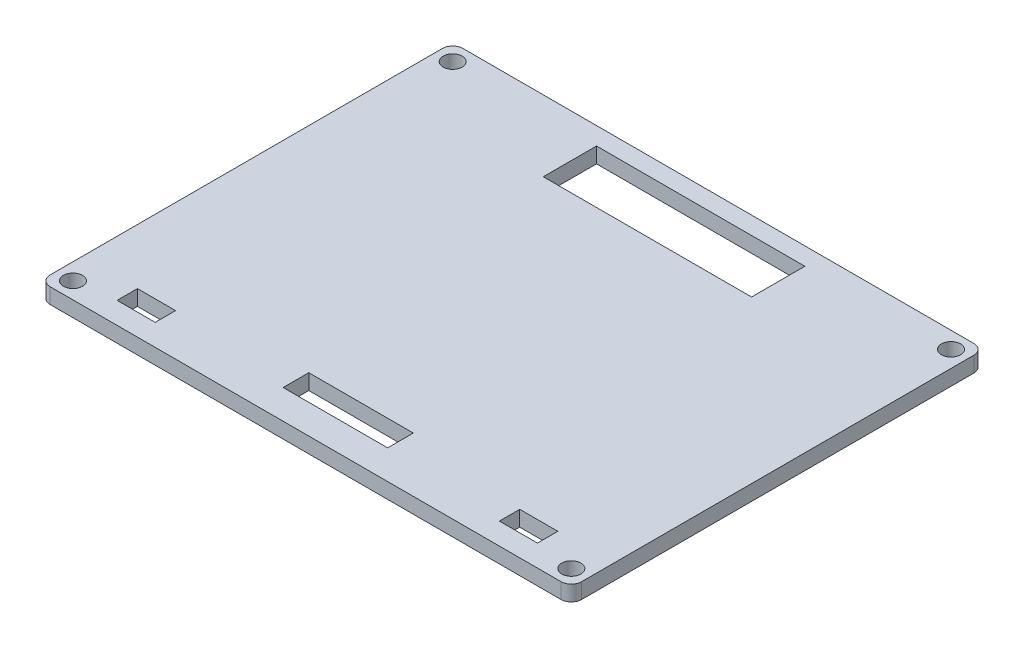
ISO-10303-21;
HEADER;
FILE_DESCRIPTION(('STEP AP214'),'2;1');
FILE_NAME('part.step','',(''),(''),'','','');
FILE_SCHEMA(('AUTOMOTIVE_DESIGN { 1 0 10303 214 1 1 1 1 }'));
ENDSEC;
DATA;
#1=APPLICATION_CONTEXT('core data for automotive mechanical design processes');
#2=APPLICATION_PROTOCOL_DEFINITION('international standard','automotive_design',2000,#1);
#3=PRODUCT_CONTEXT('',#1,'mechanical');
#4=PRODUCT('Part','Part','',(#3));
#5=PRODUCT_RELATED_PRODUCT_CATEGORY('part','',(#4));
#6=PRODUCT_DEFINITION_FORMATION('','',#4);
#7=PRODUCT_DEFINITION_CONTEXT('part definition',#1,'design');
#8=PRODUCT_DEFINITION('design','',#6,#7);
#9=PRODUCT_DEFINITION_SHAPE('','',#8);
#10=(LENGTH_UNIT() NAMED_UNIT(*) SI_UNIT(.MILLI.,.METRE.));
#11=(NAMED_UNIT(*) PLANE_ANGLE_UNIT() SI_UNIT($,.RADIAN.));
#12=(NAMED_UNIT(*) SI_UNIT($,.STERADIAN.) SOLID_ANGLE_UNIT());
#13=UNCERTAINTY_MEASURE_WITH_UNIT(LENGTH_MEASURE(1.E-05),#10,'distance_accuracy_value','');
#14=(GEOMETRIC_REPRESENTATION_CONTEXT(3) GLOBAL_UNCERTAINTY_ASSIGNED_CONTEXT((#13)) GLOBAL_UNIT_ASSIGNED_CONTEXT((#10,
#11,#12)) REPRESENTATION_CONTEXT('',''));
#15=CARTESIAN_POINT('',(0.,0.,0.));
#16=DIRECTION('',(0.,0.,1.));
#17=DIRECTION('',(1.,0.,0.));
#18=AXIS2_PLACEMENT_3D('',#15,#16,#17);
#19=CARTESIAN_POINT('',(33.3536078476636,3.,0.));
#20=DIRECTION('',(1.,0.,0.));
#21=DIRECTION('',(0.,0.,-1.));
#22=AXIS2_PLACEMENT_3D('',#19,#20,#21);
#23=PLANE('',#22);
#24=DIRECTION('',(0.,0.,1.));
#25=VECTOR('',#24,1.);
#26=CARTESIAN_POINT('',(33.3536078476636,0.,0.));
#27=LINE('',#26,#25);
#28=CARTESIAN_POINT('',(33.3536078476636,0.,31.8541583720559));
#29=VERTEX_POINT('',#28);
#30=CARTESIAN_POINT('',(33.3536078476636,0.,35.8039277224372));
#31=VERTEX_POINT('',#30);
#32=EDGE_CURVE('E356',#29,#31,#27,.T.);
#33=ORIENTED_EDGE('',*,*,#32,.F.);
#34=DIRECTION('',(0.,-1.,0.));
#35=VECTOR('',#34,1.);
#36=CARTESIAN_POINT('',(33.3536078476636,3.,31.8541583720559));
#37=LINE('',#36,#35);
#38=CARTESIAN_POINT('',(33.3536078476636,3.,31.8541583720559));
#39=VERTEX_POINT('',#38);
#40=EDGE_CURVE('E11',#39,#29,#37,.T.);
#41=ORIENTED_EDGE('',*,*,#40,.F.);
#42=DIRECTION('',(0.,0.,1.));
#43=VECTOR('',#42,1.);
#44=CARTESIAN_POINT('',(33.3536078476636,3.,0.));
#45=LINE('',#44,#43);
#46=CARTESIAN_POINT('',(33.3536078476636,3.,35.8039277224372));
#47=VERTEX_POINT('',#46);
#48=EDGE_CURVE('E223',#39,#47,#45,.T.);
#49=ORIENTED_EDGE('',*,*,#48,.T.);
#50=DIRECTION('',(0.,-1.,0.));
#51=VECTOR('',#50,1.);
#52=CARTESIAN_POINT('',(33.3536078476636,3.,35.8039277224372));
#53=LINE('',#52,#51);
#54=EDGE_CURVE('E60',#47,#31,#53,.T.);
#55=ORIENTED_EDGE('',*,*,#54,.T.);
#56=EDGE_LOOP('',(#33,#41,#49,#55));
#57=FACE_BOUND('',#56,.T.);
#58=ADVANCED_FACE('F41',(#57),#23,.T.);
#59=CARTESIAN_POINT('',(0.,3.,31.8541583720559));
#60=DIRECTION('',(0.,0.,-1.));
#61=DIRECTION('',(-1.,0.,0.));
#62=AXIS2_PLACEMENT_3D('',#59,#60,#61);
#63=PLANE('',#62);
#64=DIRECTION('',(1.,0.,0.));
#65=VECTOR('',#64,1.);
#66=CARTESIAN_POINT('',(0.,0.,31.8541583720559));
#67=LINE('',#66,#65);
#68=CARTESIAN_POINT('',(40.7411394104137,0.,31.8541583720559));
#69=VERTEX_POINT('',#68);
#70=EDGE_CURVE('E228',#29,#69,#67,.T.);
#71=ORIENTED_EDGE('',*,*,#70,.T.);
#72=DIRECTION('',(0.,-1.,0.));
#73=VECTOR('',#72,1.);
#74=CARTESIAN_POINT('',(40.7411394104137,3.,31.8541583720559));
#75=LINE('',#74,#73);
#76=CARTESIAN_POINT('',(40.7411394104137,3.,31.8541583720559));
#77=VERTEX_POINT('',#76);
#78=EDGE_CURVE('E51',#77,#69,#75,.T.);
#79=ORIENTED_EDGE('',*,*,#78,.F.);
#80=DIRECTION('',(1.,0.,0.));
#81=VECTOR('',#80,1.);
#82=CARTESIAN_POINT('',(0.,3.,31.8541583720559));
#83=LINE('',#82,#81);
#84=EDGE_CURVE('E218',#39,#77,#83,.T.);
#85=ORIENTED_EDGE('',*,*,#84,.F.);
#86=ORIENTED_EDGE('',*,*,#40,.T.);
#87=EDGE_LOOP('',(#71,#79,#85,#86));
#88=FACE_BOUND('',#87,.T.);
#89=ADVANCED_FACE('F226',(#88),#63,.F.);
#90=CARTESIAN_POINT('',(40.7411394104137,3.,0.));
#91=DIRECTION('',(1.,0.,0.));
#92=DIRECTION('',(0.,0.,-1.));
#93=AXIS2_PLACEMENT_3D('',#90,#91,#92);
#94=PLANE('',#93);
#95=DIRECTION('',(0.,0.,1.));
#96=VECTOR('',#95,1.);
#97=CARTESIAN_POINT('',(40.7411394104137,0.,0.));
#98=LINE('',#97,#96);
#99=CARTESIAN_POINT('',(40.7411394104137,0.,35.8039277224372));
#100=VERTEX_POINT('',#99);
#101=EDGE_CURVE('E359',#69,#100,#98,.T.);
#102=ORIENTED_EDGE('',*,*,#101,.T.);
#103=DIRECTION('',(0.,-1.,0.));
#104=VECTOR('',#103,1.);
#105=CARTESIAN_POINT('',(40.7411394104137,3.,35.8039277224372));
#106=LINE('',#105,#104);
#107=CARTESIAN_POINT('',(40.7411394104137,3.,35.8039277224372));
#108=VERTEX_POINT('',#107);
#109=EDGE_CURVE('E134',#108,#100,#106,.T.);
#110=ORIENTED_EDGE('',*,*,#109,.F.);
#111=DIRECTION('',(0.,0.,1.));
#112=VECTOR('',#111,1.);
#113=CARTESIAN_POINT('',(40.7411394104137,3.,0.));
#114=LINE('',#113,#112);
#115=EDGE_CURVE('E210',#77,#108,#114,.T.);
#116=ORIENTED_EDGE('',*,*,#115,.F.);
#117=ORIENTED_EDGE('',*,*,#78,.T.);
#118=EDGE_LOOP('',(#102,#110,#116,#117));
#119=FACE_BOUND('',#118,.T.);
#120=ADVANCED_FACE('F212',(#119),#94,.F.);
#121=CARTESIAN_POINT('',(-40.7411394104137,3.,0.));
#122=DIRECTION('',(1.,0.,0.));
#123=DIRECTION('',(0.,0.,-1.));
#124=AXIS2_PLACEMENT_3D('',#121,#122,#123);
#125=PLANE('',#124);
#126=DIRECTION('',(0.,0.,1.));
#127=VECTOR('',#126,1.);
#128=CARTESIAN_POINT('',(-40.7411394104137,0.,0.));
#129=LINE('',#128,#127);
#130=CARTESIAN_POINT('',(-40.7411394104137,0.,31.8541583720559));
#131=VERTEX_POINT('',#130);
#132=CARTESIAN_POINT('',(-40.7411394104137,0.,35.8039277224372));
#133=VERTEX_POINT('',#132);
#134=EDGE_CURVE('E344',#131,#133,#129,.T.);
#135=ORIENTED_EDGE('',*,*,#134,.F.);
#136=DIRECTION('',(0.,-1.,0.));
#137=VECTOR('',#136,1.);
#138=CARTESIAN_POINT('',(-40.7411394104137,3.,31.8541583720559));
#139=LINE('',#138,#137);
#140=CARTESIAN_POINT('',(-40.7411394104137,3.,31.8541583720559));
#141=VERTEX_POINT('',#140);
#142=EDGE_CURVE('E241',#141,#131,#139,.T.);
#143=ORIENTED_EDGE('',*,*,#142,.F.);
#144=DIRECTION('',(0.,0.,1.));
#145=VECTOR('',#144,1.);
#146=CARTESIAN_POINT('',(-40.7411394104137,3.,0.));
#147=LINE('',#146,#145);
#148=CARTESIAN_POINT('',(-40.7411394104137,3.,35.8039277224372));
#149=VERTEX_POINT('',#148);
#150=EDGE_CURVE('E418',#141,#149,#147,.T.);
#151=ORIENTED_EDGE('',*,*,#150,.T.);
#152=DIRECTION('',(0.,-1.,0.));
#153=VECTOR('',#152,1.);
#154=CARTESIAN_POINT('',(-40.7411394104137,3.,35.8039277224372));
#155=LINE('',#154,#153);
#156=EDGE_CURVE('E233',#149,#133,#155,.T.);
#157=ORIENTED_EDGE('',*,*,#156,.T.);
#158=EDGE_LOOP('',(#135,#143,#151,#157));
#159=FACE_BOUND('',#158,.T.);
#160=ADVANCED_FACE('F465',(#159),#125,.T.);
#161=CARTESIAN_POINT('',(0.,3.,31.8541583720559));
#162=DIRECTION('',(0.,0.,1.));
#163=DIRECTION('',(1.,0.,0.));
#164=AXIS2_PLACEMENT_3D('',#161,#162,#163);
#165=PLANE('',#164);
#166=DIRECTION('',(-1.,0.,0.));
#167=VECTOR('',#166,1.);
#168=CARTESIAN_POINT('',(0.,0.,31.8541583720559));
#169=LINE('',#168,#167);
#170=CARTESIAN_POINT('',(-33.3536078476636,0.,31.8541583720559));
#171=VERTEX_POINT('',#170);
#172=EDGE_CURVE('E347',#171,#131,#169,.T.);
#173=ORIENTED_EDGE('',*,*,#172,.F.);
#174=DIRECTION('',(0.,-1.,0.));
#175=VECTOR('',#174,1.);
#176=CARTESIAN_POINT('',(-33.3536078476636,3.,31.8541583720559));
#177=LINE('',#176,#175);
#178=CARTESIAN_POINT('',(-33.3536078476636,3.,31.8541583720559));
#179=VERTEX_POINT('',#178);
#180=EDGE_CURVE('E239',#179,#171,#177,.T.);
#181=ORIENTED_EDGE('',*,*,#180,.F.);
#182=DIRECTION('',(-1.,0.,0.));
#183=VECTOR('',#182,1.);
#184=CARTESIAN_POINT('',(0.,3.,31.8541583720559));
#185=LINE('',#184,#183);
#186=EDGE_CURVE('E421',#179,#141,#185,.T.);
#187=ORIENTED_EDGE('',*,*,#186,.T.);
#188=ORIENTED_EDGE('',*,*,#142,.T.);
#189=EDGE_LOOP('',(#173,#181,#187,#188));
#190=FACE_BOUND('',#189,.T.);
#191=ADVANCED_FACE('F461',(#190),#165,.T.);
#192=CARTESIAN_POINT('',(-33.3536078476636,3.,0.));
#193=DIRECTION('',(1.,0.,0.));
#194=DIRECTION('',(0.,0.,-1.));
#195=AXIS2_PLACEMENT_3D('',#192,#193,#194);
#196=PLANE('',#195);
#197=DIRECTION('',(0.,0.,1.));
#198=VECTOR('',#197,1.);
#199=CARTESIAN_POINT('',(-33.3536078476636,0.,0.));
#200=LINE('',#199,#198);
#201=CARTESIAN_POINT('',(-33.3536078476636,0.,35.8039277224372));
#202=VERTEX_POINT('',#201);
#203=EDGE_CURVE('E350',#171,#202,#200,.T.);
#204=ORIENTED_EDGE('',*,*,#203,.T.);
#205=DIRECTION('',(0.,-1.,0.));
#206=VECTOR('',#205,1.);
#207=CARTESIAN_POINT('',(-33.3536078476636,3.,35.8039277224372));
#208=LINE('',#207,#206);
#209=CARTESIAN_POINT('',(-33.3536078476636,3.,35.8039277224372));
#210=VERTEX_POINT('',#209);
#211=EDGE_CURVE('E235',#210,#202,#208,.T.);
#212=ORIENTED_EDGE('',*,*,#211,.F.);
#213=DIRECTION('',(0.,0.,1.));
#214=VECTOR('',#213,1.);
#215=CARTESIAN_POINT('',(-33.3536078476636,3.,0.));
#216=LINE('',#215,#214);
#217=EDGE_CURVE('E424',#179,#210,#216,.T.);
#218=ORIENTED_EDGE('',*,*,#217,.F.);
#219=ORIENTED_EDGE('',*,*,#180,.T.);
#220=EDGE_LOOP('',(#204,#212,#218,#219));
#221=FACE_BOUND('',#220,.T.);
#222=ADVANCED_FACE('F457',(#221),#196,.F.);
#223=CARTESIAN_POINT('',(0.,3.,29.3672665588529));
#224=DIRECTION('',(0.,0.,-1.));
#225=DIRECTION('',(-1.,0.,0.));
#226=AXIS2_PLACEMENT_3D('',#223,#224,#225);
#227=PLANE('',#226);
#228=DIRECTION('',(1.,0.,0.));
#229=VECTOR('',#228,1.);
#230=CARTESIAN_POINT('',(0.,0.,29.3672665588529));
#231=LINE('',#230,#229);
#232=CARTESIAN_POINT('',(-10.0207111296709,0.,29.3672665588529));
#233=VERTEX_POINT('',#232);
#234=CARTESIAN_POINT('',(10.2401427602476,0.,29.3672665588529));
#235=VERTEX_POINT('',#234);
#236=EDGE_CURVE('E332',#233,#235,#231,.T.);
#237=ORIENTED_EDGE('',*,*,#236,.T.);
#238=DIRECTION('',(0.,-1.,0.));
#239=VECTOR('',#238,1.);
#240=CARTESIAN_POINT('',(10.2401427602476,3.,29.3672665588529));
#241=LINE('',#240,#239);
#242=CARTESIAN_POINT('',(10.2401427602476,3.,29.3672665588529));
#243=VERTEX_POINT('',#242);
#244=EDGE_CURVE('E236',#243,#235,#241,.T.);
#245=ORIENTED_EDGE('',*,*,#244,.F.);
#246=DIRECTION('',(1.,0.,0.));
#247=VECTOR('',#246,1.);
#248=CARTESIAN_POINT('',(0.,3.,29.3672665588529));
#249=LINE('',#248,#247);
#250=CARTESIAN_POINT('',(-10.0207111296709,3.,29.3672665588529));
#251=VERTEX_POINT('',#250);
#252=EDGE_CURVE('E407',#251,#243,#249,.T.);
#253=ORIENTED_EDGE('',*,*,#252,.F.);
#254=DIRECTION('',(0.,-1.,0.));
#255=VECTOR('',#254,1.);
#256=CARTESIAN_POINT('',(-10.0207111296709,3.,29.3672665588529));
#257=LINE('',#256,#255);
#258=EDGE_CURVE('E243',#251,#233,#257,.T.);
#259=ORIENTED_EDGE('',*,*,#258,.T.);
#260=EDGE_LOOP('',(#237,#245,#253,#259));
#261=FACE_BOUND('',#260,.T.);
#262=ADVANCED_FACE('F460',(#261),#227,.F.);
#263=CARTESIAN_POINT('',(10.2401427602476,3.,0.));
#264=DIRECTION('',(1.,0.,0.));
#265=DIRECTION('',(0.,0.,-1.));
#266=AXIS2_PLACEMENT_3D('',#263,#264,#265);
#267=PLANE('',#266);
#268=DIRECTION('',(0.,0.,1.));
#269=VECTOR('',#268,1.);
#270=CARTESIAN_POINT('',(10.2401427602476,0.,0.));
#271=LINE('',#270,#269);
#272=CARTESIAN_POINT('',(10.2401427602476,0.,34.3410501852589));
#273=VERTEX_POINT('',#272);
#274=EDGE_CURVE('E335',#235,#273,#271,.T.);
#275=ORIENTED_EDGE('',*,*,#274,.T.);
#276=DIRECTION('',(0.,-1.,0.));
#277=VECTOR('',#276,1.);
#278=CARTESIAN_POINT('',(10.2401427602476,3.,34.3410501852589));
#279=LINE('',#278,#277);
#280=CARTESIAN_POINT('',(10.2401427602476,3.,34.3410501852589));
#281=VERTEX_POINT('',#280);
#282=EDGE_CURVE('E248',#281,#273,#279,.T.);
#283=ORIENTED_EDGE('',*,*,#282,.F.);
#284=DIRECTION('',(0.,0.,1.));
#285=VECTOR('',#284,1.);
#286=CARTESIAN_POINT('',(10.2401427602476,3.,0.));
#287=LINE('',#286,#285);
#288=EDGE_CURVE('E410',#243,#281,#287,.T.);
#289=ORIENTED_EDGE('',*,*,#288,.F.);
#290=ORIENTED_EDGE('',*,*,#244,.T.);
#291=EDGE_LOOP('',(#275,#283,#289,#290));
#292=FACE_BOUND('',#291,.T.);
#293=ADVANCED_FACE('F478',(#292),#267,.F.);
#294=CARTESIAN_POINT('',(0.,3.,34.3410501852589));
#295=DIRECTION('',(0.,0.,-1.));
#296=DIRECTION('',(-1.,0.,0.));
#297=AXIS2_PLACEMENT_3D('',#294,#295,#296);
#298=PLANE('',#297);
#299=DIRECTION('',(1.,0.,0.));
#300=VECTOR('',#299,1.);
#301=CARTESIAN_POINT('',(0.,0.,34.3410501852589));
#302=LINE('',#301,#300);
#303=CARTESIAN_POINT('',(-10.0207111296709,0.,34.3410501852589));
#304=VERTEX_POINT('',#303);
#305=EDGE_CURVE('E338',#304,#273,#302,.T.);
#306=ORIENTED_EDGE('',*,*,#305,.F.);
#307=DIRECTION('',(0.,-1.,0.));
#308=VECTOR('',#307,1.);
#309=CARTESIAN_POINT('',(-10.0207111296709,3.,34.3410501852589));
#310=LINE('',#309,#308);
#311=CARTESIAN_POINT('',(-10.0207111296709,3.,34.3410501852589));
#312=VERTEX_POINT('',#311);
#313=EDGE_CURVE('E245',#312,#304,#310,.T.);
#314=ORIENTED_EDGE('',*,*,#313,.F.);
#315=DIRECTION('',(1.,0.,0.));
#316=VECTOR('',#315,1.);
#317=CARTESIAN_POINT('',(0.,3.,34.3410501852589));
#318=LINE('',#317,#316);
#319=EDGE_CURVE('E412',#312,#281,#318,.T.);
#320=ORIENTED_EDGE('',*,*,#319,.T.);
#321=ORIENTED_EDGE('',*,*,#282,.T.);
#322=EDGE_LOOP('',(#306,#314,#320,#321));
#323=FACE_BOUND('',#322,.T.);
#324=ADVANCED_FACE('F474',(#323),#298,.T.);
#325=CARTESIAN_POINT('',(0.,3.,-40.));
#326=DIRECTION('',(0.,0.,1.));
#327=DIRECTION('',(1.,0.,0.));
#328=AXIS2_PLACEMENT_3D('',#325,#326,#327);
#329=PLANE('',#328);
#330=DIRECTION('',(-1.,0.,0.));
#331=VECTOR('',#330,1.);
#332=CARTESIAN_POINT('',(0.,0.,-40.));
#333=LINE('',#332,#331);
#334=CARTESIAN_POINT('',(49.5,0.,-40.));
#335=VERTEX_POINT('',#334);
#336=CARTESIAN_POINT('',(-49.5,0.,-40.));
#337=VERTEX_POINT('',#336);
#338=EDGE_CURVE('E305',#335,#337,#333,.T.);
#339=ORIENTED_EDGE('',*,*,#338,.T.);
#340=DIRECTION('',(0.,-1.,0.));
#341=VECTOR('',#340,1.);
#342=CARTESIAN_POINT('',(-49.5,3.,-40.));
#343=LINE('',#342,#341);
#344=CARTESIAN_POINT('',(-49.5,3.,-40.));
#345=VERTEX_POINT('',#344);
#346=EDGE_CURVE('E246',#345,#337,#343,.T.);
#347=ORIENTED_EDGE('',*,*,#346,.F.);
#348=DIRECTION('',(-1.,0.,0.));
#349=VECTOR('',#348,1.);
#350=CARTESIAN_POINT('',(0.,3.,-40.));
#351=LINE('',#350,#349);
#352=CARTESIAN_POINT('',(49.5,3.,-40.));
#353=VERTEX_POINT('',#352);
#354=EDGE_CURVE('E381',#353,#345,#351,.T.);
#355=ORIENTED_EDGE('',*,*,#354,.F.);
#356=DIRECTION('',(0.,-1.,0.));
#357=VECTOR('',#356,1.);
#358=CARTESIAN_POINT('',(49.5,3.,-40.));
#359=LINE('',#358,#357);
#360=EDGE_CURVE('E252',#353,#335,#359,.T.);
#361=ORIENTED_EDGE('',*,*,#360,.T.);
#362=EDGE_LOOP('',(#339,#347,#355,#361));
#363=FACE_BOUND('',#362,.T.);
#364=ADVANCED_FACE('F477',(#363),#329,.F.);
#365=CARTESIAN_POINT('',(-49.5,3.,-38.));
#366=DIRECTION('',(0.,-1.,0.));
#367=DIRECTION('',(0.,0.,-1.));
#368=AXIS2_PLACEMENT_3D('',#365,#366,#367);
#369=CYLINDRICAL_SURFACE('',#368,2.);
#370=CARTESIAN_POINT('',(-49.5,0.,-38.));
#371=DIRECTION('',(0.,1.,0.));
#372=DIRECTION('',(0.,0.,1.));
#373=AXIS2_PLACEMENT_3D('',#370,#371,#372);
#374=CIRCLE('',#373,2.);
#375=CARTESIAN_POINT('',(-51.5,0.,-38.));
#376=VERTEX_POINT('',#375);
#377=EDGE_CURVE('E308',#337,#376,#374,.T.);
#378=ORIENTED_EDGE('',*,*,#377,.T.);
#379=DIRECTION('',(0.,-1.,0.));
#380=VECTOR('',#379,1.);
#381=CARTESIAN_POINT('',(-51.5,3.,-38.));
#382=LINE('',#381,#380);
#383=CARTESIAN_POINT('',(-51.5,3.,-38.));
#384=VERTEX_POINT('',#383);
#385=EDGE_CURVE('E267',#384,#376,#382,.T.);
#386=ORIENTED_EDGE('',*,*,#385,.F.);
#387=CARTESIAN_POINT('',(-49.5,3.,-38.));
#388=DIRECTION('',(0.,1.,0.));
#389=DIRECTION('',(0.,0.,1.));
#390=AXIS2_PLACEMENT_3D('',#387,#388,#389);
#391=CIRCLE('',#390,2.);
#392=EDGE_CURVE('E384',#345,#384,#391,.T.);
#393=ORIENTED_EDGE('',*,*,#392,.F.);
#394=ORIENTED_EDGE('',*,*,#346,.T.);
#395=EDGE_LOOP('',(#378,#386,#393,#394));
#396=FACE_BOUND('',#395,.T.);
#397=ADVANCED_FACE('F517',(#396),#369,.T.);
#398=CARTESIAN_POINT('',(-51.5,3.,0.));
#399=DIRECTION('',(-1.,0.,0.));
#400=DIRECTION('',(0.,0.,1.));
#401=AXIS2_PLACEMENT_3D('',#398,#399,#400);
#402=PLANE('',#401);
#403=DIRECTION('',(0.,0.,-1.));
#404=VECTOR('',#403,1.);
#405=CARTESIAN_POINT('',(-51.5,0.,0.));
#406=LINE('',#405,#404);
#407=CARTESIAN_POINT('',(-51.5,0.,38.));
#408=VERTEX_POINT('',#407);
#409=EDGE_CURVE('E311',#408,#376,#406,.T.);
#410=ORIENTED_EDGE('',*,*,#409,.F.);
#411=DIRECTION('',(0.,-1.,0.));
#412=VECTOR('',#411,1.);
#413=CARTESIAN_POINT('',(-51.5,3.,38.));
#414=LINE('',#413,#412);
#415=CARTESIAN_POINT('',(-51.5,3.,38.));
#416=VERTEX_POINT('',#415);
#417=EDGE_CURVE('E265',#416,#408,#414,.T.);
#418=ORIENTED_EDGE('',*,*,#417,.F.);
#419=DIRECTION('',(0.,0.,-1.));
#420=VECTOR('',#419,1.);
#421=CARTESIAN_POINT('',(-51.5,3.,0.));
#422=LINE('',#421,#420);
#423=EDGE_CURVE('E386',#416,#384,#422,.T.);
#424=ORIENTED_EDGE('',*,*,#423,.T.);
#425=ORIENTED_EDGE('',*,*,#385,.T.);
#426=EDGE_LOOP('',(#410,#418,#424,#425));
#427=FACE_BOUND('',#426,.T.);
#428=ADVANCED_FACE('F513',(#427),#402,.T.);
#429=CARTESIAN_POINT('',(-49.5,3.,38.));
#430=DIRECTION('',(0.,-1.,0.));
#431=DIRECTION('',(0.,0.,-1.));
#432=AXIS2_PLACEMENT_3D('',#429,#430,#431);
#433=CYLINDRICAL_SURFACE('',#432,2.);
#434=CARTESIAN_POINT('',(-49.5,0.,38.));
#435=DIRECTION('',(0.,1.,0.));
#436=DIRECTION('',(0.,0.,1.));
#437=AXIS2_PLACEMENT_3D('',#434,#435,#436);
#438=CIRCLE('',#437,2.);
#439=CARTESIAN_POINT('',(-49.5,0.,40.));
#440=VERTEX_POINT('',#439);
#441=EDGE_CURVE('E314',#440,#408,#438,.F.);
#442=ORIENTED_EDGE('',*,*,#441,.F.);
#443=DIRECTION('',(0.,-1.,0.));
#444=VECTOR('',#443,1.);
#445=CARTESIAN_POINT('',(-49.5,3.,40.));
#446=LINE('',#445,#444);
#447=CARTESIAN_POINT('',(-49.5,3.,40.));
#448=VERTEX_POINT('',#447);
#449=EDGE_CURVE('E263',#448,#440,#446,.T.);
#450=ORIENTED_EDGE('',*,*,#449,.F.);
#451=CARTESIAN_POINT('',(-49.5,3.,38.));
#452=DIRECTION('',(0.,1.,0.));
#453=DIRECTION('',(0.,0.,1.));
#454=AXIS2_PLACEMENT_3D('',#451,#452,#453);
#455=CIRCLE('',#454,2.);
#456=EDGE_CURVE('E389',#448,#416,#455,.F.);
#457=ORIENTED_EDGE('',*,*,#456,.T.);
#458=ORIENTED_EDGE('',*,*,#417,.T.);
#459=EDGE_LOOP('',(#442,#450,#457,#458));
#460=FACE_BOUND('',#459,.T.);
#461=ADVANCED_FACE('F509',(#460),#433,.T.);
#462=CARTESIAN_POINT('',(0.,3.,40.));
#463=DIRECTION('',(0.,0.,1.));
#464=DIRECTION('',(1.,0.,0.));
#465=AXIS2_PLACEMENT_3D('',#462,#463,#464);
#466=PLANE('',#465);
#467=DIRECTION('',(-1.,0.,0.));
#468=VECTOR('',#467,1.);
#469=CARTESIAN_POINT('',(0.,0.,40.));
#470=LINE('',#469,#468);
#471=CARTESIAN_POINT('',(49.5,0.,40.));
#472=VERTEX_POINT('',#471);
#473=EDGE_CURVE('E317',#472,#440,#470,.T.);
#474=ORIENTED_EDGE('',*,*,#473,.F.);
#475=DIRECTION('',(0.,-1.,0.));
#476=VECTOR('',#475,1.);
#477=CARTESIAN_POINT('',(49.5,3.,40.));
#478=LINE('',#477,#476);
#479=CARTESIAN_POINT('',(49.5,3.,40.));
#480=VERTEX_POINT('',#479);
#481=EDGE_CURVE('E261',#480,#472,#478,.T.);
#482=ORIENTED_EDGE('',*,*,#481,.F.);
#483=DIRECTION('',(-1.,0.,0.));
#484=VECTOR('',#483,1.);
#485=CARTESIAN_POINT('',(0.,3.,40.));
#486=LINE('',#485,#484);
#487=EDGE_CURVE('E392',#480,#448,#486,.T.);
#488=ORIENTED_EDGE('',*,*,#487,.T.);
#489=ORIENTED_EDGE('',*,*,#449,.T.);
#490=EDGE_LOOP('',(#474,#482,#488,#489));
#491=FACE_BOUND('',#490,.T.);
#492=ADVANCED_FACE('F505',(#491),#466,.T.);
#493=CARTESIAN_POINT('',(49.5,3.,38.));
#494=DIRECTION('',(0.,-1.,0.));
#495=DIRECTION('',(0.,0.,-1.));
#496=AXIS2_PLACEMENT_3D('',#493,#494,#495);
#497=CYLINDRICAL_SURFACE('',#496,2.);
#498=CARTESIAN_POINT('',(49.5,0.,38.));
#499=DIRECTION('',(0.,1.,0.));
#500=DIRECTION('',(0.,0.,1.));
#501=AXIS2_PLACEMENT_3D('',#498,#499,#500);
#502=CIRCLE('',#501,2.);
#503=CARTESIAN_POINT('',(51.5,0.,38.));
#504=VERTEX_POINT('',#503);
#505=EDGE_CURVE('E320',#472,#504,#502,.T.);
#506=ORIENTED_EDGE('',*,*,#505,.T.);
#507=DIRECTION('',(0.,-1.,0.));
#508=VECTOR('',#507,1.);
#509=CARTESIAN_POINT('',(51.5,3.,38.));
#510=LINE('',#509,#508);
#511=CARTESIAN_POINT('',(51.5,3.,38.));
#512=VERTEX_POINT('',#511);
#513=EDGE_CURVE('E258',#512,#504,#510,.T.);
#514=ORIENTED_EDGE('',*,*,#513,.F.);
#515=CARTESIAN_POINT('',(49.5,3.,38.));
#516=DIRECTION('',(0.,1.,0.));
#517=DIRECTION('',(0.,0.,1.));
#518=AXIS2_PLACEMENT_3D('',#515,#516,#517);
#519=CIRCLE('',#518,2.);
#520=EDGE_CURVE('E395',#480,#512,#519,.T.);
#521=ORIENTED_EDGE('',*,*,#520,.F.);
#522=ORIENTED_EDGE('',*,*,#481,.T.);
#523=EDGE_LOOP('',(#506,#514,#521,#522));
#524=FACE_BOUND('',#523,.T.);
#525=ADVANCED_FACE('F501',(#524),#497,.T.);
#526=CARTESIAN_POINT('',(51.5,3.,0.));
#527=DIRECTION('',(-1.,0.,0.));
#528=DIRECTION('',(0.,0.,1.));
#529=AXIS2_PLACEMENT_3D('',#526,#527,#528);
#530=PLANE('',#529);
#531=DIRECTION('',(0.,0.,-1.));
#532=VECTOR('',#531,1.);
#533=CARTESIAN_POINT('',(51.5,0.,0.));
#534=LINE('',#533,#532);
#535=CARTESIAN_POINT('',(51.5,0.,-38.));
#536=VERTEX_POINT('',#535);
#537=EDGE_CURVE('E322',#504,#536,#534,.T.);
#538=ORIENTED_EDGE('',*,*,#537,.T.);
#539=DIRECTION('',(0.,-1.,0.));
#540=VECTOR('',#539,1.);
#541=CARTESIAN_POINT('',(51.5,3.,-38.));
#542=LINE('',#541,#540);
#543=CARTESIAN_POINT('',(51.5,3.,-38.));
#544=VERTEX_POINT('',#543);
#545=EDGE_CURVE('E255',#544,#536,#542,.T.);
#546=ORIENTED_EDGE('',*,*,#545,.F.);
#547=DIRECTION('',(0.,0.,-1.));
#548=VECTOR('',#547,1.);
#549=CARTESIAN_POINT('',(51.5,3.,0.));
#550=LINE('',#549,#548);
#551=EDGE_CURVE('E397',#512,#544,#550,.T.);
#552=ORIENTED_EDGE('',*,*,#551,.F.);
#553=ORIENTED_EDGE('',*,*,#513,.T.);
#554=EDGE_LOOP('',(#538,#546,#552,#553));
#555=FACE_BOUND('',#554,.T.);
#556=ADVANCED_FACE('F498',(#555),#530,.F.);
#557=CARTESIAN_POINT('',(0.,3.,-26.2491408524346));
#558=DIRECTION('',(0.,0.,1.));
#559=DIRECTION('',(1.,0.,0.));
#560=AXIS2_PLACEMENT_3D('',#557,#558,#559);
#561=PLANE('',#560);
#562=DIRECTION('',(-1.,0.,0.));
#563=VECTOR('',#562,1.);
#564=CARTESIAN_POINT('',(0.,0.,-26.2491408524346));
#565=LINE('',#564,#563);
#566=CARTESIAN_POINT('',(20.1874301732059,0.,-26.2491408524346));
#567=VERTEX_POINT('',#566);
#568=CARTESIAN_POINT('',(-20.1874301732059,0.,-26.2491408524346));
#569=VERTEX_POINT('',#568);
#570=EDGE_CURVE('E287',#567,#569,#565,.T.);
#571=ORIENTED_EDGE('',*,*,#570,.T.);
#572=DIRECTION('',(0.,-1.,0.));
#573=VECTOR('',#572,1.);
#574=CARTESIAN_POINT('',(-20.1874301732059,3.,-26.2491408524346));
#575=LINE('',#574,#573);
#576=CARTESIAN_POINT('',(-20.1874301732059,3.,-26.2491408524346));
#577=VERTEX_POINT('',#576);
#578=EDGE_CURVE('E45',#577,#569,#575,.T.);
#579=ORIENTED_EDGE('',*,*,#578,.F.);
#580=DIRECTION('',(-1.,0.,0.));
#581=VECTOR('',#580,1.);
#582=CARTESIAN_POINT('',(0.,3.,-26.2491408524346));
#583=LINE('',#582,#581);
#584=CARTESIAN_POINT('',(20.1874301732059,3.,-26.2491408524346));
#585=VERTEX_POINT('',#584);
#586=EDGE_CURVE('E363',#585,#577,#583,.T.);
#587=ORIENTED_EDGE('',*,*,#586,.F.);
#588=DIRECTION('',(0.,-1.,0.));
#589=VECTOR('',#588,1.);
#590=CARTESIAN_POINT('',(20.1874301732059,3.,-26.2491408524346));
#591=LINE('',#590,#589);
#592=EDGE_CURVE('E271',#585,#567,#591,.T.);
#593=ORIENTED_EDGE('',*,*,#592,.T.);
#594=EDGE_LOOP('',(#571,#579,#587,#593));
#595=FACE_BOUND('',#594,.T.);
#596=ADVANCED_FACE('F43',(#595),#561,.F.);
#597=CARTESIAN_POINT('',(-20.1874301732059,3.,0.));
#598=DIRECTION('',(-1.,0.,0.));
#599=DIRECTION('',(0.,0.,1.));
#600=AXIS2_PLACEMENT_3D('',#597,#598,#599);
#601=PLANE('',#600);
#602=DIRECTION('',(0.,0.,-1.));
#603=VECTOR('',#602,1.);
#604=CARTESIAN_POINT('',(-20.1874301732059,0.,0.));
#605=LINE('',#604,#603);
#606=CARTESIAN_POINT('',(-20.1874301732059,0.,-36.5704318741446));
#607=VERTEX_POINT('',#606);
#608=EDGE_CURVE('E282',#569,#607,#605,.T.);
#609=ORIENTED_EDGE('',*,*,#608,.T.);
#610=DIRECTION('',(0.,-1.,0.));
#611=VECTOR('',#610,1.);
#612=CARTESIAN_POINT('',(-20.1874301732059,3.,-36.5704318741446));
#613=LINE('',#612,#611);
#614=CARTESIAN_POINT('',(-20.1874301732059,3.,-36.5704318741446));
#615=VERTEX_POINT('',#614);
#616=EDGE_CURVE('E274',#615,#607,#613,.T.);
#617=ORIENTED_EDGE('',*,*,#616,.F.);
#618=DIRECTION('',(0.,0.,-1.));
#619=VECTOR('',#618,1.);
#620=CARTESIAN_POINT('',(-20.1874301732059,3.,0.));
#621=LINE('',#620,#619);
#622=EDGE_CURVE('E147',#577,#615,#621,.T.);
#623=ORIENTED_EDGE('',*,*,#622,.F.);
#624=ORIENTED_EDGE('',*,*,#578,.T.);
#625=EDGE_LOOP('',(#609,#617,#623,#624));
#626=FACE_BOUND('',#625,.T.);
#627=ADVANCED_FACE('F281',(#626),#601,.F.);
#628=CARTESIAN_POINT('',(0.,3.,-36.5704318741446));
#629=DIRECTION('',(0.,0.,1.));
#630=DIRECTION('',(1.,0.,0.));
#631=AXIS2_PLACEMENT_3D('',#628,#629,#630);
#632=PLANE('',#631);
#633=DIRECTION('',(-1.,0.,0.));
#634=VECTOR('',#633,1.);
#635=CARTESIAN_POINT('',(0.,0.,-36.5704318741446));
#636=LINE('',#635,#634);
#637=CARTESIAN_POINT('',(20.1874301732059,0.,-36.5704318741446));
#638=VERTEX_POINT('',#637);
#639=EDGE_CURVE('E292',#638,#607,#636,.T.);
#640=ORIENTED_EDGE('',*,*,#639,.F.);
#641=DIRECTION('',(0.,-1.,0.));
#642=VECTOR('',#641,1.);
#643=CARTESIAN_POINT('',(20.1874301732059,3.,-36.5704318741446));
#644=LINE('',#643,#642);
#645=CARTESIAN_POINT('',(20.1874301732059,3.,-36.5704318741446));
#646=VERTEX_POINT('',#645);
#647=EDGE_CURVE('E273',#646,#638,#644,.T.);
#648=ORIENTED_EDGE('',*,*,#647,.F.);
#649=DIRECTION('',(-1.,0.,0.));
#650=VECTOR('',#649,1.);
#651=CARTESIAN_POINT('',(0.,3.,-36.5704318741446));
#652=LINE('',#651,#650);
#653=EDGE_CURVE('E368',#646,#615,#652,.T.);
#654=ORIENTED_EDGE('',*,*,#653,.T.);
#655=ORIENTED_EDGE('',*,*,#616,.T.);
#656=EDGE_LOOP('',(#640,#648,#654,#655));
#657=FACE_BOUND('',#656,.T.);
#658=ADVANCED_FACE('F455',(#657),#632,.T.);
#659=CARTESIAN_POINT('',(0.,3.,35.8039277224372));
#660=DIRECTION('',(0.,0.,1.));
#661=DIRECTION('',(1.,0.,0.));
#662=AXIS2_PLACEMENT_3D('',#659,#660,#661);
#663=PLANE('',#662);
#664=DIRECTION('',(-1.,0.,0.));
#665=VECTOR('',#664,1.);
#666=CARTESIAN_POINT('',(0.,0.,35.8039277224372));
#667=LINE('',#666,#665);
#668=EDGE_CURVE('E353',#202,#133,#667,.T.);
#669=ORIENTED_EDGE('',*,*,#668,.T.);
#670=ORIENTED_EDGE('',*,*,#156,.F.);
#671=DIRECTION('',(-1.,0.,0.));
#672=VECTOR('',#671,1.);
#673=CARTESIAN_POINT('',(0.,3.,35.8039277224372));
#674=LINE('',#673,#672);
#675=EDGE_CURVE('E427',#210,#149,#674,.T.);
#676=ORIENTED_EDGE('',*,*,#675,.F.);
#677=ORIENTED_EDGE('',*,*,#211,.T.);
#678=EDGE_LOOP('',(#669,#670,#676,#677));
#679=FACE_BOUND('',#678,.T.);
#680=ADVANCED_FACE('F451',(#679),#663,.F.);
#681=CARTESIAN_POINT('',(-10.0207111296709,3.,0.));
#682=DIRECTION('',(1.,0.,0.));
#683=DIRECTION('',(0.,0.,-1.));
#684=AXIS2_PLACEMENT_3D('',#681,#682,#683);
#685=PLANE('',#684);
#686=DIRECTION('',(0.,0.,1.));
#687=VECTOR('',#686,1.);
#688=CARTESIAN_POINT('',(-10.0207111296709,0.,0.));
#689=LINE('',#688,#687);
#690=EDGE_CURVE('E341',#233,#304,#689,.T.);
#691=ORIENTED_EDGE('',*,*,#690,.F.);
#692=ORIENTED_EDGE('',*,*,#258,.F.);
#693=DIRECTION('',(0.,0.,1.));
#694=VECTOR('',#693,1.);
#695=CARTESIAN_POINT('',(-10.0207111296709,3.,0.));
#696=LINE('',#695,#694);
#697=EDGE_CURVE('E415',#251,#312,#696,.T.);
#698=ORIENTED_EDGE('',*,*,#697,.T.);
#699=ORIENTED_EDGE('',*,*,#313,.T.);
#700=EDGE_LOOP('',(#691,#692,#698,#699));
#701=FACE_BOUND('',#700,.T.);
#702=ADVANCED_FACE('F454',(#701),#685,.T.);
#703=CARTESIAN_POINT('',(48.296806281225,3.,36.7968062812248));
#704=DIRECTION('',(0.,-1.,0.));
#705=DIRECTION('',(0.,0.,-1.));
#706=AXIS2_PLACEMENT_3D('',#703,#704,#705);
#707=CYLINDRICAL_SURFACE('',#706,1.84999999999998);
#708=CARTESIAN_POINT('',(48.296806281225,3.,36.7968062812248));
#709=DIRECTION('',(0.,1.,0.));
#710=DIRECTION('',(0.,0.,1.));
#711=AXIS2_PLACEMENT_3D('',#708,#709,#710);
#712=CIRCLE('',#711,1.84999999999998);
#713=CARTESIAN_POINT('',(48.296806281225,3.,38.6468062812248));
#714=VERTEX_POINT('',#713);
#715=EDGE_CURVE('E404',#714,#714,#712,.T.);
#716=ORIENTED_EDGE('',*,*,#715,.T.);
#717=EDGE_LOOP('',(#716));
#718=FACE_BOUND('',#717,.T.);
#719=CARTESIAN_POINT('',(48.296806281225,0.,36.7968062812248));
#720=DIRECTION('',(0.,1.,0.));
#721=DIRECTION('',(0.,0.,1.));
#722=AXIS2_PLACEMENT_3D('',#719,#720,#721);
#723=CIRCLE('',#722,1.84999999999998);
#724=CARTESIAN_POINT('',(48.296806281225,0.,38.6468062812248));
#725=VERTEX_POINT('',#724);
#726=EDGE_CURVE('E329',#725,#725,#723,.T.);
#727=ORIENTED_EDGE('',*,*,#726,.F.);
#728=EDGE_LOOP('',(#727));
#729=FACE_BOUND('',#728,.T.);
#730=ADVANCED_FACE('F472',(#718,#729),#707,.F.);
#731=CARTESIAN_POINT('',(-48.2968062812249,3.,36.796806281225));
#732=DIRECTION('',(0.,-1.,0.));
#733=DIRECTION('',(0.,0.,-1.));
#734=AXIS2_PLACEMENT_3D('',#731,#732,#733);
#735=CYLINDRICAL_SURFACE('',#734,1.85);
#736=CARTESIAN_POINT('',(-48.2968062812249,3.,36.796806281225));
#737=DIRECTION('',(0.,1.,0.));
#738=DIRECTION('',(0.,0.,1.));
#739=AXIS2_PLACEMENT_3D('',#736,#737,#738);
#740=CIRCLE('',#739,1.85);
#741=CARTESIAN_POINT('',(-48.2968062812249,3.,38.646806281225));
#742=VERTEX_POINT('',#741);
#743=EDGE_CURVE('E401',#742,#742,#740,.F.);
#744=ORIENTED_EDGE('',*,*,#743,.F.);
#745=EDGE_LOOP('',(#744));
#746=FACE_BOUND('',#745,.T.);
#747=CARTESIAN_POINT('',(-48.2968062812249,0.,36.796806281225));
#748=DIRECTION('',(0.,1.,0.));
#749=DIRECTION('',(0.,0.,1.));
#750=AXIS2_PLACEMENT_3D('',#747,#748,#749);
#751=CIRCLE('',#750,1.85);
#752=CARTESIAN_POINT('',(-48.2968062812249,0.,38.646806281225));
#753=VERTEX_POINT('',#752);
#754=EDGE_CURVE('E326',#753,#753,#751,.F.);
#755=ORIENTED_EDGE('',*,*,#754,.T.);
#756=EDGE_LOOP('',(#755));
#757=FACE_BOUND('',#756,.T.);
#758=ADVANCED_FACE('F488',(#746,#757),#735,.F.);
#759=CARTESIAN_POINT('',(49.5,3.,-38.));
#760=DIRECTION('',(0.,-1.,0.));
#761=DIRECTION('',(0.,0.,-1.));
#762=AXIS2_PLACEMENT_3D('',#759,#760,#761);
#763=CYLINDRICAL_SURFACE('',#762,2.);
#764=CARTESIAN_POINT('',(49.5,0.,-38.));
#765=DIRECTION('',(0.,1.,0.));
#766=DIRECTION('',(0.,0.,1.));
#767=AXIS2_PLACEMENT_3D('',#764,#765,#766);
#768=CIRCLE('',#767,2.);
#769=EDGE_CURVE('E324',#536,#335,#768,.T.);
#770=ORIENTED_EDGE('',*,*,#769,.T.);
#771=ORIENTED_EDGE('',*,*,#360,.F.);
#772=CARTESIAN_POINT('',(49.5,3.,-38.));
#773=DIRECTION('',(0.,1.,0.));
#774=DIRECTION('',(0.,0.,1.));
#775=AXIS2_PLACEMENT_3D('',#772,#773,#774);
#776=CIRCLE('',#775,2.);
#777=EDGE_CURVE('E399',#544,#353,#776,.T.);
#778=ORIENTED_EDGE('',*,*,#777,.F.);
#779=ORIENTED_EDGE('',*,*,#545,.T.);
#780=EDGE_LOOP('',(#770,#771,#778,#779));
#781=FACE_BOUND('',#780,.T.);
#782=ADVANCED_FACE('F492',(#781),#763,.T.);
#783=CARTESIAN_POINT('',(48.2968062812249,3.,-36.7968062812249));
#784=DIRECTION('',(0.,-1.,0.));
#785=DIRECTION('',(0.,0.,-1.));
#786=AXIS2_PLACEMENT_3D('',#783,#784,#785);
#787=CYLINDRICAL_SURFACE('',#786,1.84999999999998);
#788=CARTESIAN_POINT('',(48.2968062812249,3.,-36.7968062812249));
#789=DIRECTION('',(0.,1.,0.));
#790=DIRECTION('',(0.,0.,1.));
#791=AXIS2_PLACEMENT_3D('',#788,#789,#790);
#792=CIRCLE('',#791,1.84999999999998);
#793=CARTESIAN_POINT('',(48.2968062812249,3.,-34.9468062812249));
#794=VERTEX_POINT('',#793);
#795=EDGE_CURVE('E378',#794,#794,#792,.F.);
#796=ORIENTED_EDGE('',*,*,#795,.F.);
#797=EDGE_LOOP('',(#796));
#798=FACE_BOUND('',#797,.T.);
#799=CARTESIAN_POINT('',(48.2968062812249,0.,-36.7968062812249));
#800=DIRECTION('',(0.,1.,0.));
#801=DIRECTION('',(0.,0.,1.));
#802=AXIS2_PLACEMENT_3D('',#799,#800,#801);
#803=CIRCLE('',#802,1.84999999999998);
#804=CARTESIAN_POINT('',(48.2968062812249,0.,-34.9468062812249));
#805=VERTEX_POINT('',#804);
#806=EDGE_CURVE('E302',#805,#805,#803,.F.);
#807=ORIENTED_EDGE('',*,*,#806,.T.);
#808=EDGE_LOOP('',(#807));
#809=FACE_BOUND('',#808,.T.);
#810=ADVANCED_FACE('F496',(#798,#809),#787,.F.);
#811=CARTESIAN_POINT('',(-48.2968062812249,3.,-36.796806281225));
#812=DIRECTION('',(0.,-1.,0.));
#813=DIRECTION('',(0.,0.,-1.));
#814=AXIS2_PLACEMENT_3D('',#811,#812,#813);
#815=CYLINDRICAL_SURFACE('',#814,1.84999999999996);
#816=CARTESIAN_POINT('',(-48.2968062812249,3.,-36.796806281225));
#817=DIRECTION('',(0.,1.,0.));
#818=DIRECTION('',(0.,0.,1.));
#819=AXIS2_PLACEMENT_3D('',#816,#817,#818);
#820=CIRCLE('',#819,1.84999999999996);
#821=CARTESIAN_POINT('',(-48.2968062812249,3.,-34.946806281225));
#822=VERTEX_POINT('',#821);
#823=EDGE_CURVE('E375',#822,#822,#820,.T.);
#824=ORIENTED_EDGE('',*,*,#823,.T.);
#825=EDGE_LOOP('',(#824));
#826=FACE_BOUND('',#825,.T.);
#827=CARTESIAN_POINT('',(-48.2968062812249,0.,-36.796806281225));
#828=DIRECTION('',(0.,1.,0.));
#829=DIRECTION('',(0.,0.,1.));
#830=AXIS2_PLACEMENT_3D('',#827,#828,#829);
#831=CIRCLE('',#830,1.84999999999996);
#832=CARTESIAN_POINT('',(-48.2968062812249,0.,-34.946806281225));
#833=VERTEX_POINT('',#832);
#834=EDGE_CURVE('E299',#833,#833,#831,.T.);
#835=ORIENTED_EDGE('',*,*,#834,.F.);
#836=EDGE_LOOP('',(#835));
#837=FACE_BOUND('',#836,.T.);
#838=ADVANCED_FACE('F439',(#826,#837),#815,.F.);
#839=CARTESIAN_POINT('',(20.1874301732059,3.,0.));
#840=DIRECTION('',(-1.,0.,0.));
#841=DIRECTION('',(0.,0.,1.));
#842=AXIS2_PLACEMENT_3D('',#839,#840,#841);
#843=PLANE('',#842);
#844=DIRECTION('',(0.,0.,-1.));
#845=VECTOR('',#844,1.);
#846=CARTESIAN_POINT('',(20.1874301732059,0.,0.));
#847=LINE('',#846,#845);
#848=EDGE_CURVE('E297',#567,#638,#847,.T.);
#849=ORIENTED_EDGE('',*,*,#848,.F.);
#850=ORIENTED_EDGE('',*,*,#592,.F.);
#851=DIRECTION('',(0.,0.,-1.));
#852=VECTOR('',#851,1.);
#853=CARTESIAN_POINT('',(20.1874301732059,3.,0.));
#854=LINE('',#853,#852);
#855=EDGE_CURVE('E372',#585,#646,#854,.T.);
#856=ORIENTED_EDGE('',*,*,#855,.T.);
#857=ORIENTED_EDGE('',*,*,#647,.T.);
#858=EDGE_LOOP('',(#849,#850,#856,#857));
#859=FACE_BOUND('',#858,.T.);
#860=ADVANCED_FACE('F431',(#859),#843,.T.);
#861=CARTESIAN_POINT('',(0.,3.,35.8039277224372));
#862=DIRECTION('',(0.,0.,-1.));
#863=DIRECTION('',(-1.,0.,0.));
#864=AXIS2_PLACEMENT_3D('',#861,#862,#863);
#865=PLANE('',#864);
#866=DIRECTION('',(1.,0.,0.));
#867=VECTOR('',#866,1.);
#868=CARTESIAN_POINT('',(0.,0.,35.8039277224372));
#869=LINE('',#868,#867);
#870=EDGE_CURVE('E361',#31,#100,#869,.T.);
#871=ORIENTED_EDGE('',*,*,#870,.F.);
#872=ORIENTED_EDGE('',*,*,#54,.F.);
#873=DIRECTION('',(1.,0.,0.));
#874=VECTOR('',#873,1.);
#875=CARTESIAN_POINT('',(0.,3.,35.8039277224372));
#876=LINE('',#875,#874);
#877=EDGE_CURVE('E217',#47,#108,#876,.T.);
#878=ORIENTED_EDGE('',*,*,#877,.T.);
#879=ORIENTED_EDGE('',*,*,#109,.T.);
#880=EDGE_LOOP('',(#871,#872,#878,#879));
#881=FACE_BOUND('',#880,.T.);
#882=ADVANCED_FACE('F429',(#881),#865,.T.);
#883=CARTESIAN_POINT('',(0.,3.,0.));
#884=DIRECTION('',(0.,1.,0.));
#885=DIRECTION('',(0.,0.,1.));
#886=AXIS2_PLACEMENT_3D('',#883,#884,#885);
#887=PLANE('',#886);
#888=ORIENTED_EDGE('',*,*,#586,.T.);
#889=ORIENTED_EDGE('',*,*,#622,.T.);
#890=ORIENTED_EDGE('',*,*,#653,.F.);
#891=ORIENTED_EDGE('',*,*,#855,.F.);
#892=EDGE_LOOP('',(#888,#889,#890,#891));
#893=FACE_BOUND('',#892,.T.);
#894=ORIENTED_EDGE('',*,*,#823,.F.);
#895=EDGE_LOOP('',(#894));
#896=FACE_BOUND('',#895,.T.);
#897=ORIENTED_EDGE('',*,*,#795,.T.);
#898=EDGE_LOOP('',(#897));
#899=FACE_BOUND('',#898,.T.);
#900=ORIENTED_EDGE('',*,*,#354,.T.);
#901=ORIENTED_EDGE('',*,*,#392,.T.);
#902=ORIENTED_EDGE('',*,*,#423,.F.);
#903=ORIENTED_EDGE('',*,*,#456,.F.);
#904=ORIENTED_EDGE('',*,*,#487,.F.);
#905=ORIENTED_EDGE('',*,*,#520,.T.);
#906=ORIENTED_EDGE('',*,*,#551,.T.);
#907=ORIENTED_EDGE('',*,*,#777,.T.);
#908=EDGE_LOOP('',(#900,#901,#902,#903,#904,#905,#906,#907));
#909=FACE_BOUND('',#908,.T.);
#910=ORIENTED_EDGE('',*,*,#743,.T.);
#911=EDGE_LOOP('',(#910));
#912=FACE_BOUND('',#911,.T.);
#913=ORIENTED_EDGE('',*,*,#715,.F.);
#914=EDGE_LOOP('',(#913));
#915=FACE_BOUND('',#914,.T.);
#916=ORIENTED_EDGE('',*,*,#252,.T.);
#917=ORIENTED_EDGE('',*,*,#288,.T.);
#918=ORIENTED_EDGE('',*,*,#319,.F.);
#919=ORIENTED_EDGE('',*,*,#697,.F.);
#920=EDGE_LOOP('',(#916,#917,#918,#919));
#921=FACE_BOUND('',#920,.T.);
#922=ORIENTED_EDGE('',*,*,#150,.F.);
#923=ORIENTED_EDGE('',*,*,#186,.F.);
#924=ORIENTED_EDGE('',*,*,#217,.T.);
#925=ORIENTED_EDGE('',*,*,#675,.T.);
#926=EDGE_LOOP('',(#922,#923,#924,#925));
#927=FACE_BOUND('',#926,.T.);
#928=ORIENTED_EDGE('',*,*,#48,.F.);
#929=ORIENTED_EDGE('',*,*,#84,.T.);
#930=ORIENTED_EDGE('',*,*,#115,.T.);
#931=ORIENTED_EDGE('',*,*,#877,.F.);
#932=EDGE_LOOP('',(#928,#929,#930,#931));
#933=FACE_BOUND('',#932,.T.);
#934=ADVANCED_FACE('F222',(#893,#896,#899,#909,#912,#915,#921,#927,#933),#887,.T.);
#935=CARTESIAN_POINT('',(0.,0.,0.));
#936=DIRECTION('',(0.,1.,0.));
#937=DIRECTION('',(0.,0.,1.));
#938=AXIS2_PLACEMENT_3D('',#935,#936,#937);
#939=PLANE('',#938);
#940=ORIENTED_EDGE('',*,*,#570,.F.);
#941=ORIENTED_EDGE('',*,*,#848,.T.);
#942=ORIENTED_EDGE('',*,*,#639,.T.);
#943=ORIENTED_EDGE('',*,*,#608,.F.);
#944=EDGE_LOOP('',(#940,#941,#942,#943));
#945=FACE_BOUND('',#944,.T.);
#946=ORIENTED_EDGE('',*,*,#834,.T.);
#947=EDGE_LOOP('',(#946));
#948=FACE_BOUND('',#947,.T.);
#949=ORIENTED_EDGE('',*,*,#806,.F.);
#950=EDGE_LOOP('',(#949));
#951=FACE_BOUND('',#950,.T.);
#952=ORIENTED_EDGE('',*,*,#338,.F.);
#953=ORIENTED_EDGE('',*,*,#769,.F.);
#954=ORIENTED_EDGE('',*,*,#537,.F.);
#955=ORIENTED_EDGE('',*,*,#505,.F.);
#956=ORIENTED_EDGE('',*,*,#473,.T.);
#957=ORIENTED_EDGE('',*,*,#441,.T.);
#958=ORIENTED_EDGE('',*,*,#409,.T.);
#959=ORIENTED_EDGE('',*,*,#377,.F.);
#960=EDGE_LOOP('',(#952,#953,#954,#955,#956,#957,#958,#959));
#961=FACE_BOUND('',#960,.T.);
#962=ORIENTED_EDGE('',*,*,#754,.F.);
#963=EDGE_LOOP('',(#962));
#964=FACE_BOUND('',#963,.T.);
#965=ORIENTED_EDGE('',*,*,#726,.T.);
#966=EDGE_LOOP('',(#965));
#967=FACE_BOUND('',#966,.T.);
#968=ORIENTED_EDGE('',*,*,#236,.F.);
#969=ORIENTED_EDGE('',*,*,#690,.T.);
#970=ORIENTED_EDGE('',*,*,#305,.T.);
#971=ORIENTED_EDGE('',*,*,#274,.F.);
#972=EDGE_LOOP('',(#968,#969,#970,#971));
#973=FACE_BOUND('',#972,.T.);
#974=ORIENTED_EDGE('',*,*,#134,.T.);
#975=ORIENTED_EDGE('',*,*,#668,.F.);
#976=ORIENTED_EDGE('',*,*,#203,.F.);
#977=ORIENTED_EDGE('',*,*,#172,.T.);
#978=EDGE_LOOP('',(#974,#975,#976,#977));
#979=FACE_BOUND('',#978,.T.);
#980=ORIENTED_EDGE('',*,*,#32,.T.);
#981=ORIENTED_EDGE('',*,*,#870,.T.);
#982=ORIENTED_EDGE('',*,*,#101,.F.);
#983=ORIENTED_EDGE('',*,*,#70,.F.);
#984=EDGE_LOOP('',(#980,#981,#982,#983));
#985=FACE_BOUND('',#984,.T.);
#986=ADVANCED_FACE('F437',(#945,#948,#951,#961,#964,#967,#973,#979,#985),#939,.F.);
#987=CLOSED_SHELL('',(#58,#89,#120,#160,#191,#222,#262,#293,#324,#364,#397,#428,#461,#492,#525,
#556,#596,#627,#658,#680,#702,#730,#758,#782,#810,#838,#860,#882,#934,#986));
#988=MANIFOLD_SOLID_BREP('B2',#987);
#989=ADVANCED_BREP_SHAPE_REPRESENTATION('',(#18,#988),#14);
#990=SHAPE_DEFINITION_REPRESENTATION(#9,#989);
ENDSEC;
END-ISO-10303-21;
